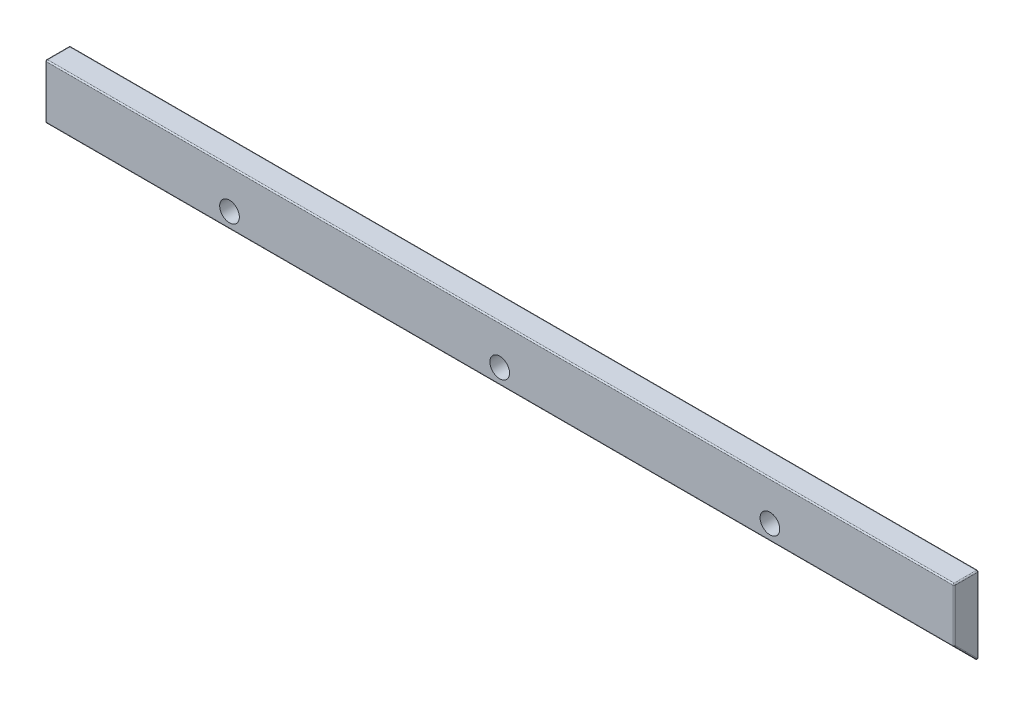
ISO-10303-21;
HEADER;
FILE_DESCRIPTION(('STEP AP214'),'2;1');
FILE_NAME('part.step','',(''),(''),'','','');
FILE_SCHEMA(('AUTOMOTIVE_DESIGN { 1 0 10303 214 1 1 1 1 }'));
ENDSEC;
DATA;
#1=APPLICATION_CONTEXT('core data for automotive mechanical design processes');
#2=APPLICATION_PROTOCOL_DEFINITION('international standard','automotive_design',2000,#1);
#3=PRODUCT_CONTEXT('',#1,'mechanical');
#4=PRODUCT('Part','Part','',(#3));
#5=PRODUCT_RELATED_PRODUCT_CATEGORY('part','',(#4));
#6=PRODUCT_DEFINITION_FORMATION('','',#4);
#7=PRODUCT_DEFINITION_CONTEXT('part definition',#1,'design');
#8=PRODUCT_DEFINITION('design','',#6,#7);
#9=PRODUCT_DEFINITION_SHAPE('','',#8);
#10=(LENGTH_UNIT() NAMED_UNIT(*) SI_UNIT(.MILLI.,.METRE.));
#11=(NAMED_UNIT(*) PLANE_ANGLE_UNIT() SI_UNIT($,.RADIAN.));
#12=(NAMED_UNIT(*) SI_UNIT($,.STERADIAN.) SOLID_ANGLE_UNIT());
#13=UNCERTAINTY_MEASURE_WITH_UNIT(LENGTH_MEASURE(1.E-05),#10,'distance_accuracy_value','');
#14=(GEOMETRIC_REPRESENTATION_CONTEXT(3) GLOBAL_UNCERTAINTY_ASSIGNED_CONTEXT((#13)) GLOBAL_UNIT_ASSIGNED_CONTEXT((#10,
#11,#12)) REPRESENTATION_CONTEXT('',''));
#15=CARTESIAN_POINT('',(0.,0.,0.));
#16=DIRECTION('',(0.,0.,1.));
#17=DIRECTION('',(1.,0.,0.));
#18=AXIS2_PLACEMENT_3D('',#15,#16,#17);
#19=CARTESIAN_POINT('',(43.7052218456962,-1.20000000000006,2.));
#20=DIRECTION('',(0.,0.,-1.));
#21=DIRECTION('',(-1.,0.,0.));
#22=AXIS2_PLACEMENT_3D('',#19,#20,#21);
#23=PLANE('',#22);
#24=CARTESIAN_POINT('',(22.,0.,2.));
#25=DIRECTION('',(0.,0.,1.));
#26=DIRECTION('',(1.,0.,0.));
#27=AXIS2_PLACEMENT_3D('',#24,#25,#26);
#28=CIRCLE('',#27,0.799999999999988);
#29=CARTESIAN_POINT('',(22.8,0.,2.));
#30=VERTEX_POINT('',#29);
#31=EDGE_CURVE('E592',#30,#30,#28,.T.);
#32=ORIENTED_EDGE('',*,*,#31,.F.);
#33=EDGE_LOOP('',(#32));
#34=FACE_BOUND('',#33,.T.);
#35=CARTESIAN_POINT('',(0.,0.,2.));
#36=DIRECTION('',(0.,0.,1.));
#37=DIRECTION('',(1.,0.,0.));
#38=AXIS2_PLACEMENT_3D('',#35,#36,#37);
#39=CIRCLE('',#38,0.799999999999988);
#40=CARTESIAN_POINT('',(0.799999999999988,0.,2.));
#41=VERTEX_POINT('',#40);
#42=EDGE_CURVE('E584',#41,#41,#39,.T.);
#43=ORIENTED_EDGE('',*,*,#42,.F.);
#44=EDGE_LOOP('',(#43));
#45=FACE_BOUND('',#44,.T.);
#46=DIRECTION('',(-1.,0.,0.));
#47=VECTOR('',#46,1.);
#48=CARTESIAN_POINT('',(43.7052218456962,-1.15857864376275,2.));
#49=LINE('',#48,#47);
#50=CARTESIAN_POINT('',(-36.9,-1.15857864376275,2.));
#51=VERTEX_POINT('',#50);
#52=CARTESIAN_POINT('',(36.9,-1.15857864376275,2.));
#53=VERTEX_POINT('',#52);
#54=EDGE_CURVE('E173',#51,#53,#49,.F.);
#55=ORIENTED_EDGE('',*,*,#54,.T.);
#56=DIRECTION('',(0.,-1.,0.));
#57=VECTOR('',#56,1.);
#58=CARTESIAN_POINT('',(36.9,3.20000000000006,2.));
#59=LINE('',#58,#57);
#60=CARTESIAN_POINT('',(36.9,3.10000000000006,2.));
#61=VERTEX_POINT('',#60);
#62=EDGE_CURVE('E178',#53,#61,#59,.F.);
#63=ORIENTED_EDGE('',*,*,#62,.T.);
#64=DIRECTION('',(-1.,0.,0.));
#65=VECTOR('',#64,1.);
#66=CARTESIAN_POINT('',(43.7052218456962,3.10000000000006,2.));
#67=LINE('',#66,#65);
#68=CARTESIAN_POINT('',(-36.9,3.10000000000006,2.));
#69=VERTEX_POINT('',#68);
#70=EDGE_CURVE('E175',#61,#69,#67,.T.);
#71=ORIENTED_EDGE('',*,*,#70,.T.);
#72=DIRECTION('',(0.,-1.,0.));
#73=VECTOR('',#72,1.);
#74=CARTESIAN_POINT('',(-36.9,-1.20000000000006,2.));
#75=LINE('',#74,#73);
#76=EDGE_CURVE('E171',#69,#51,#75,.T.);
#77=ORIENTED_EDGE('',*,*,#76,.T.);
#78=EDGE_LOOP('',(#55,#63,#71,#77));
#79=FACE_BOUND('',#78,.T.);
#80=CARTESIAN_POINT('',(-22.,0.,2.));
#81=DIRECTION('',(0.,0.,1.));
#82=DIRECTION('',(1.,0.,0.));
#83=AXIS2_PLACEMENT_3D('',#80,#81,#82);
#84=CIRCLE('',#83,0.799999999999988);
#85=CARTESIAN_POINT('',(-21.2,0.,2.));
#86=VERTEX_POINT('',#85);
#87=EDGE_CURVE('E577',#86,#86,#84,.T.);
#88=ORIENTED_EDGE('',*,*,#87,.F.);
#89=EDGE_LOOP('',(#88));
#90=FACE_BOUND('',#89,.T.);
#91=ADVANCED_FACE('F35',(#34,#45,#79,#90),#23,.F.);
#92=CARTESIAN_POINT('',(43.7052218456962,-3.20000000000006,0.));
#93=DIRECTION('',(0.,0.,1.));
#94=DIRECTION('',(1.,0.,0.));
#95=AXIS2_PLACEMENT_3D('',#92,#93,#94);
#96=PLANE('',#95);
#97=CARTESIAN_POINT('',(22.,0.,0.));
#98=DIRECTION('',(0.,0.,1.));
#99=DIRECTION('',(1.,0.,0.));
#100=AXIS2_PLACEMENT_3D('',#97,#98,#99);
#101=CIRCLE('',#100,0.799999999999988);
#102=CARTESIAN_POINT('',(22.8,0.,0.));
#103=VERTEX_POINT('',#102);
#104=EDGE_CURVE('E589',#103,#103,#101,.T.);
#105=ORIENTED_EDGE('',*,*,#104,.T.);
#106=EDGE_LOOP('',(#105));
#107=FACE_BOUND('',#106,.T.);
#108=CARTESIAN_POINT('',(0.,0.,0.));
#109=DIRECTION('',(0.,0.,1.));
#110=DIRECTION('',(1.,0.,0.));
#111=AXIS2_PLACEMENT_3D('',#108,#109,#110);
#112=CIRCLE('',#111,0.799999999999989);
#113=CARTESIAN_POINT('',(0.799999999999989,0.,0.));
#114=VERTEX_POINT('',#113);
#115=EDGE_CURVE('E579',#114,#114,#112,.T.);
#116=ORIENTED_EDGE('',*,*,#115,.T.);
#117=EDGE_LOOP('',(#116));
#118=FACE_BOUND('',#117,.T.);
#119=CARTESIAN_POINT('',(-22.,0.,0.));
#120=DIRECTION('',(0.,0.,1.));
#121=DIRECTION('',(1.,0.,0.));
#122=AXIS2_PLACEMENT_3D('',#119,#120,#121);
#123=CIRCLE('',#122,0.799999999999988);
#124=CARTESIAN_POINT('',(-21.2,0.,0.));
#125=VERTEX_POINT('',#124);
#126=EDGE_CURVE('E134',#125,#125,#123,.T.);
#127=ORIENTED_EDGE('',*,*,#126,.T.);
#128=EDGE_LOOP('',(#127));
#129=FACE_BOUND('',#128,.T.);
#130=DIRECTION('',(-1.,0.,0.));
#131=VECTOR('',#130,1.);
#132=CARTESIAN_POINT('',(43.7052218456962,3.10000000000006,0.));
#133=LINE('',#132,#131);
#134=CARTESIAN_POINT('',(-36.9,3.10000000000006,0.));
#135=VERTEX_POINT('',#134);
#136=CARTESIAN_POINT('',(36.9,3.10000000000006,0.));
#137=VERTEX_POINT('',#136);
#138=EDGE_CURVE('E131',#135,#137,#133,.F.);
#139=ORIENTED_EDGE('',*,*,#138,.T.);
#140=DIRECTION('',(0.,1.,0.));
#141=VECTOR('',#140,1.);
#142=CARTESIAN_POINT('',(36.9,-3.20000000000006,0.));
#143=LINE('',#142,#141);
#144=CARTESIAN_POINT('',(36.9,-2.95857864376275,0.));
#145=VERTEX_POINT('',#144);
#146=EDGE_CURVE('E169',#137,#145,#143,.F.);
#147=ORIENTED_EDGE('',*,*,#146,.T.);
#148=DIRECTION('',(-1.,0.,0.));
#149=VECTOR('',#148,1.);
#150=CARTESIAN_POINT('',(43.7052218456962,-2.95857864376275,0.));
#151=LINE('',#150,#149);
#152=CARTESIAN_POINT('',(-36.9,-2.95857864376275,0.));
#153=VERTEX_POINT('',#152);
#154=EDGE_CURVE('E166',#145,#153,#151,.T.);
#155=ORIENTED_EDGE('',*,*,#154,.T.);
#156=DIRECTION('',(0.,1.,0.));
#157=VECTOR('',#156,1.);
#158=CARTESIAN_POINT('',(-36.9,3.20000000000006,0.));
#159=LINE('',#158,#157);
#160=EDGE_CURVE('E161',#153,#135,#159,.T.);
#161=ORIENTED_EDGE('',*,*,#160,.T.);
#162=EDGE_LOOP('',(#139,#147,#155,#161));
#163=FACE_BOUND('',#162,.T.);
#164=ADVANCED_FACE('F295',(#107,#118,#129,#163),#96,.F.);
#165=CARTESIAN_POINT('',(43.7052218456962,3.20000000000006,2.));
#166=DIRECTION('',(0.,-1.,0.));
#167=DIRECTION('',(0.,0.,-1.));
#168=AXIS2_PLACEMENT_3D('',#165,#166,#167);
#169=PLANE('',#168);
#170=DIRECTION('',(-1.,0.,0.));
#171=VECTOR('',#170,1.);
#172=CARTESIAN_POINT('',(43.7052218456962,3.20000000000006,1.9));
#173=LINE('',#172,#171);
#174=CARTESIAN_POINT('',(-36.9,3.20000000000006,1.9));
#175=VERTEX_POINT('',#174);
#176=CARTESIAN_POINT('',(36.9,3.20000000000006,1.9));
#177=VERTEX_POINT('',#176);
#178=EDGE_CURVE('E154',#175,#177,#173,.F.);
#179=ORIENTED_EDGE('',*,*,#178,.T.);
#180=DIRECTION('',(0.,0.,1.));
#181=VECTOR('',#180,1.);
#182=CARTESIAN_POINT('',(36.9,3.20000000000006,0.));
#183=LINE('',#182,#181);
#184=CARTESIAN_POINT('',(36.9,3.20000000000006,0.1));
#185=VERTEX_POINT('',#184);
#186=EDGE_CURVE('E158',#177,#185,#183,.F.);
#187=ORIENTED_EDGE('',*,*,#186,.T.);
#188=DIRECTION('',(-1.,0.,0.));
#189=VECTOR('',#188,1.);
#190=CARTESIAN_POINT('',(43.7052218456962,3.20000000000006,0.1));
#191=LINE('',#190,#189);
#192=CARTESIAN_POINT('',(-36.9,3.20000000000006,0.1));
#193=VERTEX_POINT('',#192);
#194=EDGE_CURVE('E129',#185,#193,#191,.T.);
#195=ORIENTED_EDGE('',*,*,#194,.T.);
#196=DIRECTION('',(0.,0.,1.));
#197=VECTOR('',#196,1.);
#198=CARTESIAN_POINT('',(-36.9,3.20000000000006,2.));
#199=LINE('',#198,#197);
#200=EDGE_CURVE('E148',#193,#175,#199,.T.);
#201=ORIENTED_EDGE('',*,*,#200,.T.);
#202=EDGE_LOOP('',(#179,#187,#195,#201));
#203=FACE_BOUND('',#202,.T.);
#204=ADVANCED_FACE('F156',(#203),#169,.F.);
#205=CARTESIAN_POINT('',(43.7052218456962,-3.20000000000006,0.));
#206=DIRECTION('',(0.,0.707106781186548,-0.707106781186547));
#207=DIRECTION('',(0.,0.707106781186547,0.707106781186548));
#208=AXIS2_PLACEMENT_3D('',#205,#206,#207);
#209=PLANE('',#208);
#210=DIRECTION('',(-1.,0.,0.));
#211=VECTOR('',#210,1.);
#212=CARTESIAN_POINT('',(43.7052218456962,-3.0292893218814,0.170710678118655));
#213=LINE('',#212,#211);
#214=CARTESIAN_POINT('',(-36.9,-3.0292893218814,0.170710678118655));
#215=VERTEX_POINT('',#214);
#216=CARTESIAN_POINT('',(36.9,-3.0292893218814,0.170710678118655));
#217=VERTEX_POINT('',#216);
#218=EDGE_CURVE('E184',#215,#217,#213,.F.);
#219=ORIENTED_EDGE('',*,*,#218,.T.);
#220=DIRECTION('',(0.,-0.707106781186547,-0.707106781186548));
#221=VECTOR('',#220,1.);
#222=CARTESIAN_POINT('',(36.9,-1.20000000000007,1.99999999999999));
#223=LINE('',#222,#221);
#224=CARTESIAN_POINT('',(36.9,-1.2292893218814,1.97071067811865));
#225=VERTEX_POINT('',#224);
#226=EDGE_CURVE('E187',#217,#225,#223,.F.);
#227=ORIENTED_EDGE('',*,*,#226,.T.);
#228=DIRECTION('',(-1.,0.,0.));
#229=VECTOR('',#228,1.);
#230=CARTESIAN_POINT('',(43.7052218456962,-1.2292893218814,1.97071067811865));
#231=LINE('',#230,#229);
#232=CARTESIAN_POINT('',(-36.9,-1.2292893218814,1.97071067811865));
#233=VERTEX_POINT('',#232);
#234=EDGE_CURVE('E182',#225,#233,#231,.T.);
#235=ORIENTED_EDGE('',*,*,#234,.T.);
#236=DIRECTION('',(0.,-0.707106781186547,-0.707106781186548));
#237=VECTOR('',#236,1.);
#238=CARTESIAN_POINT('',(-36.9,-3.20000000000006,0.));
#239=LINE('',#238,#237);
#240=EDGE_CURVE('E180',#233,#215,#239,.T.);
#241=ORIENTED_EDGE('',*,*,#240,.T.);
#242=EDGE_LOOP('',(#219,#227,#235,#241));
#243=FACE_BOUND('',#242,.T.);
#244=ADVANCED_FACE('F308',(#243),#209,.F.);
#245=CARTESIAN_POINT('',(37.,-80.8,224.488099265355));
#246=DIRECTION('',(1.,0.,0.));
#247=DIRECTION('',(0.,-1.,0.));
#248=AXIS2_PLACEMENT_3D('',#245,#246,#247);
#249=PLANE('',#248);
#250=DIRECTION('',(0.,0.,1.));
#251=VECTOR('',#250,1.);
#252=CARTESIAN_POINT('',(37.,3.10000000000005,2.));
#253=LINE('',#252,#251);
#254=CARTESIAN_POINT('',(37.,3.10000000000005,0.099999999999989));
#255=VERTEX_POINT('',#254);
#256=CARTESIAN_POINT('',(37.,3.10000000000005,1.90000000000001));
#257=VERTEX_POINT('',#256);
#258=EDGE_CURVE('E193',#255,#257,#253,.T.);
#259=ORIENTED_EDGE('',*,*,#258,.T.);
#260=DIRECTION('',(0.,-1.,0.));
#261=VECTOR('',#260,1.);
#262=CARTESIAN_POINT('',(37.,-1.20000000000006,1.90000000000001));
#263=LINE('',#262,#261);
#264=CARTESIAN_POINT('',(37.,-1.1585786437627,1.90000000000001));
#265=VERTEX_POINT('',#264);
#266=EDGE_CURVE('E195',#257,#265,#263,.T.);
#267=ORIENTED_EDGE('',*,*,#266,.T.);
#268=DIRECTION('',(0.,-0.707106781186547,-0.707106781186548));
#269=VECTOR('',#268,1.);
#270=CARTESIAN_POINT('',(37.,-3.1292893218814,-0.0707106781186878));
#271=LINE('',#270,#269);
#272=CARTESIAN_POINT('',(37.,-2.95857864376273,0.099999999999989));
#273=VERTEX_POINT('',#272);
#274=EDGE_CURVE('E189',#265,#273,#271,.T.);
#275=ORIENTED_EDGE('',*,*,#274,.T.);
#276=DIRECTION('',(0.,1.,0.));
#277=VECTOR('',#276,1.);
#278=CARTESIAN_POINT('',(37.,3.20000000000006,0.099999999999989));
#279=LINE('',#278,#277);
#280=EDGE_CURVE('E191',#273,#255,#279,.T.);
#281=ORIENTED_EDGE('',*,*,#280,.T.);
#282=EDGE_LOOP('',(#259,#267,#275,#281));
#283=FACE_BOUND('',#282,.T.);
#284=ADVANCED_FACE('F273',(#283),#249,.T.);
#285=CARTESIAN_POINT('',(-37.,-80.8,224.488099265355));
#286=DIRECTION('',(-1.,0.,0.));
#287=DIRECTION('',(0.,1.,0.));
#288=AXIS2_PLACEMENT_3D('',#285,#286,#287);
#289=PLANE('',#288);
#290=DIRECTION('',(0.,-1.,0.));
#291=VECTOR('',#290,1.);
#292=CARTESIAN_POINT('',(-37.,3.20000000000006,1.9));
#293=LINE('',#292,#291);
#294=CARTESIAN_POINT('',(-37.,-1.15857864376275,1.9));
#295=VERTEX_POINT('',#294);
#296=CARTESIAN_POINT('',(-37.,3.10000000000006,1.9));
#297=VERTEX_POINT('',#296);
#298=EDGE_CURVE('E44',#295,#297,#293,.F.);
#299=ORIENTED_EDGE('',*,*,#298,.T.);
#300=DIRECTION('',(0.,0.,1.));
#301=VECTOR('',#300,1.);
#302=CARTESIAN_POINT('',(-37.,3.10000000000006,0.));
#303=LINE('',#302,#301);
#304=CARTESIAN_POINT('',(-37.,3.10000000000006,0.1));
#305=VERTEX_POINT('',#304);
#306=EDGE_CURVE('E11',#297,#305,#303,.F.);
#307=ORIENTED_EDGE('',*,*,#306,.T.);
#308=DIRECTION('',(0.,1.,0.));
#309=VECTOR('',#308,1.);
#310=CARTESIAN_POINT('',(-37.,-3.20000000000006,0.1));
#311=LINE('',#310,#309);
#312=CARTESIAN_POINT('',(-37.,-2.95857864376275,0.1));
#313=VERTEX_POINT('',#312);
#314=EDGE_CURVE('E198',#305,#313,#311,.F.);
#315=ORIENTED_EDGE('',*,*,#314,.T.);
#316=DIRECTION('',(0.,-0.707106781186547,-0.707106781186548));
#317=VECTOR('',#316,1.);
#318=CARTESIAN_POINT('',(-37.,-1.1292893218814,1.92928932188135));
#319=LINE('',#318,#317);
#320=EDGE_CURVE('E55',#313,#295,#319,.F.);
#321=ORIENTED_EDGE('',*,*,#320,.T.);
#322=EDGE_LOOP('',(#299,#307,#315,#321));
#323=FACE_BOUND('',#322,.T.);
#324=ADVANCED_FACE('F301',(#323),#289,.T.);
#325=CARTESIAN_POINT('',(43.7052218456962,-1.15857864376275,1.9));
#326=DIRECTION('',(-1.,0.,0.));
#327=DIRECTION('',(0.,0.,1.));
#328=AXIS2_PLACEMENT_3D('',#325,#326,#327);
#329=CYLINDRICAL_SURFACE('',#328,0.1);
#330=CARTESIAN_POINT('',(36.9,-1.15857864376275,1.9));
#331=DIRECTION('',(1.,0.,0.));
#332=DIRECTION('',(0.,1.,0.));
#333=AXIS2_PLACEMENT_3D('',#330,#331,#332);
#334=CIRCLE('',#333,0.1);
#335=EDGE_CURVE('E39',#53,#225,#334,.T.);
#336=ORIENTED_EDGE('',*,*,#335,.F.);
#337=ORIENTED_EDGE('',*,*,#54,.F.);
#338=CARTESIAN_POINT('',(-36.9,-1.15857864376275,1.9));
#339=DIRECTION('',(-1.,0.,0.));
#340=DIRECTION('',(0.,0.,1.));
#341=AXIS2_PLACEMENT_3D('',#338,#339,#340);
#342=CIRCLE('',#341,0.1);
#343=EDGE_CURVE('E251',#233,#51,#342,.T.);
#344=ORIENTED_EDGE('',*,*,#343,.F.);
#345=ORIENTED_EDGE('',*,*,#234,.F.);
#346=EDGE_LOOP('',(#336,#337,#344,#345));
#347=FACE_BOUND('',#346,.T.);
#348=ADVANCED_FACE('F37',(#347),#329,.T.);
#349=CARTESIAN_POINT('',(36.9,-1.15857864376275,1.9));
#350=DIRECTION('',(0.,0.,1.));
#351=DIRECTION('',(1.,0.,0.));
#352=AXIS2_PLACEMENT_3D('',#349,#350,#351);
#353=SPHERICAL_SURFACE('',#352,0.1);
#354=CARTESIAN_POINT('',(36.9,-1.1585786437627,1.90000000000001));
#355=DIRECTION('',(0.,-1.,-4.40186082029171E-13));
#356=DIRECTION('',(0.,4.40186082029171E-13,-1.));
#357=AXIS2_PLACEMENT_3D('',#354,#355,#356);
#358=CIRCLE('',#357,0.1);
#359=EDGE_CURVE('E246',#53,#265,#358,.F.);
#360=ORIENTED_EDGE('',*,*,#359,.F.);
#361=ORIENTED_EDGE('',*,*,#335,.T.);
#362=CARTESIAN_POINT('',(36.9,-1.15857864376275,1.9));
#363=DIRECTION('',(-4.03256168587688E-13,0.707106781186548,0.707106781186548));
#364=DIRECTION('',(0.,-0.707106781186548,0.707106781186548));
#365=AXIS2_PLACEMENT_3D('',#362,#363,#364);
#366=CIRCLE('',#365,0.1);
#367=EDGE_CURVE('E249',#265,#225,#366,.F.);
#368=ORIENTED_EDGE('',*,*,#367,.F.);
#369=EDGE_LOOP('',(#360,#361,#368));
#370=FACE_BOUND('',#369,.T.);
#371=ADVANCED_FACE('F262',(#370),#353,.T.);
#372=CARTESIAN_POINT('',(-36.9,-1.15857864376275,1.9));
#373=DIRECTION('',(0.,0.,1.));
#374=DIRECTION('',(1.,0.,0.));
#375=AXIS2_PLACEMENT_3D('',#372,#373,#374);
#376=SPHERICAL_SURFACE('',#375,0.1);
#377=CARTESIAN_POINT('',(-36.9,-1.15857864376275,1.9));
#378=DIRECTION('',(0.,0.707106781186549,0.707106781186546));
#379=DIRECTION('',(0.,-0.707106781186546,0.707106781186549));
#380=AXIS2_PLACEMENT_3D('',#377,#378,#379);
#381=CIRCLE('',#380,0.1);
#382=EDGE_CURVE('E241',#233,#295,#381,.F.);
#383=ORIENTED_EDGE('',*,*,#382,.F.);
#384=ORIENTED_EDGE('',*,*,#343,.T.);
#385=CARTESIAN_POINT('',(-36.9,-1.15857864376275,1.9));
#386=DIRECTION('',(0.,-1.,0.));
#387=DIRECTION('',(1.,0.,0.));
#388=AXIS2_PLACEMENT_3D('',#385,#386,#387);
#389=CIRCLE('',#388,0.1);
#390=EDGE_CURVE('E243',#295,#51,#389,.F.);
#391=ORIENTED_EDGE('',*,*,#390,.F.);
#392=EDGE_LOOP('',(#383,#384,#391));
#393=FACE_BOUND('',#392,.T.);
#394=ADVANCED_FACE('F374',(#393),#376,.T.);
#395=CARTESIAN_POINT('',(36.9,70.3147603107963,73.3733389545591));
#396=DIRECTION('',(0.,0.707106781186547,0.707106781186548));
#397=DIRECTION('',(0.,-0.707106781186548,0.707106781186547));
#398=AXIS2_PLACEMENT_3D('',#395,#396,#397);
#399=CYLINDRICAL_SURFACE('',#398,0.1);
#400=ORIENTED_EDGE('',*,*,#367,.T.);
#401=ORIENTED_EDGE('',*,*,#226,.F.);
#402=CARTESIAN_POINT('',(36.9,-2.95857864376273,0.099999999999989));
#403=DIRECTION('',(0.,-0.707106781186498,-0.707106781186597));
#404=DIRECTION('',(0.,0.707106781186597,-0.707106781186498));
#405=AXIS2_PLACEMENT_3D('',#402,#403,#404);
#406=CIRCLE('',#405,0.1);
#407=EDGE_CURVE('E236',#273,#217,#406,.T.);
#408=ORIENTED_EDGE('',*,*,#407,.F.);
#409=ORIENTED_EDGE('',*,*,#274,.F.);
#410=EDGE_LOOP('',(#400,#401,#408,#409));
#411=FACE_BOUND('',#410,.T.);
#412=ADVANCED_FACE('F269',(#411),#399,.T.);
#413=CARTESIAN_POINT('',(36.9,-80.8,1.90000000000001));
#414=DIRECTION('',(0.,1.,0.));
#415=DIRECTION('',(-1.,0.,0.));
#416=AXIS2_PLACEMENT_3D('',#413,#414,#415);
#417=CYLINDRICAL_SURFACE('',#416,0.1);
#418=ORIENTED_EDGE('',*,*,#359,.T.);
#419=ORIENTED_EDGE('',*,*,#266,.F.);
#420=CARTESIAN_POINT('',(36.9,3.10000000000006,1.9));
#421=DIRECTION('',(0.,1.,0.));
#422=DIRECTION('',(-1.,0.,0.));
#423=AXIS2_PLACEMENT_3D('',#420,#421,#422);
#424=CIRCLE('',#423,0.1);
#425=EDGE_CURVE('E233',#61,#257,#424,.T.);
#426=ORIENTED_EDGE('',*,*,#425,.F.);
#427=ORIENTED_EDGE('',*,*,#62,.F.);
#428=EDGE_LOOP('',(#418,#419,#426,#427));
#429=FACE_BOUND('',#428,.T.);
#430=ADVANCED_FACE('F279',(#429),#417,.T.);
#431=CARTESIAN_POINT('',(43.7052218456962,3.10000000000006,1.9));
#432=DIRECTION('',(-1.,0.,0.));
#433=DIRECTION('',(0.,0.,1.));
#434=AXIS2_PLACEMENT_3D('',#431,#432,#433);
#435=CYLINDRICAL_SURFACE('',#434,0.1);
#436=CARTESIAN_POINT('',(-36.9,3.10000000000006,1.9));
#437=DIRECTION('',(-1.,0.,0.));
#438=DIRECTION('',(0.,0.,1.));
#439=AXIS2_PLACEMENT_3D('',#436,#437,#438);
#440=CIRCLE('',#439,0.1);
#441=EDGE_CURVE('E227',#69,#175,#440,.T.);
#442=ORIENTED_EDGE('',*,*,#441,.F.);
#443=ORIENTED_EDGE('',*,*,#70,.F.);
#444=CARTESIAN_POINT('',(36.9,3.10000000000006,1.9));
#445=DIRECTION('',(1.,0.,0.));
#446=DIRECTION('',(0.,0.,-1.));
#447=AXIS2_PLACEMENT_3D('',#444,#445,#446);
#448=CIRCLE('',#447,0.1);
#449=EDGE_CURVE('E230',#177,#61,#448,.T.);
#450=ORIENTED_EDGE('',*,*,#449,.F.);
#451=ORIENTED_EDGE('',*,*,#178,.F.);
#452=EDGE_LOOP('',(#442,#443,#450,#451));
#453=FACE_BOUND('',#452,.T.);
#454=ADVANCED_FACE('F365',(#453),#435,.T.);
#455=CARTESIAN_POINT('',(-36.9,-1.20000000000005,1.9));
#456=DIRECTION('',(0.,1.,0.));
#457=DIRECTION('',(-1.,0.,0.));
#458=AXIS2_PLACEMENT_3D('',#455,#456,#457);
#459=CYLINDRICAL_SURFACE('',#458,0.1);
#460=ORIENTED_EDGE('',*,*,#390,.T.);
#461=ORIENTED_EDGE('',*,*,#76,.F.);
#462=CARTESIAN_POINT('',(-36.9,3.10000000000006,1.9));
#463=DIRECTION('',(0.,1.,0.));
#464=DIRECTION('',(0.,0.,1.));
#465=AXIS2_PLACEMENT_3D('',#462,#463,#464);
#466=CIRCLE('',#465,0.1);
#467=EDGE_CURVE('E225',#297,#69,#466,.T.);
#468=ORIENTED_EDGE('',*,*,#467,.F.);
#469=ORIENTED_EDGE('',*,*,#298,.F.);
#470=EDGE_LOOP('',(#460,#461,#468,#469));
#471=FACE_BOUND('',#470,.T.);
#472=ADVANCED_FACE('F361',(#471),#459,.T.);
#473=CARTESIAN_POINT('',(-36.9,-3.1292893218814,-0.0707106781186507));
#474=DIRECTION('',(0.,0.707106781186547,0.707106781186548));
#475=DIRECTION('',(0.,-0.707106781186548,0.707106781186547));
#476=AXIS2_PLACEMENT_3D('',#473,#474,#475);
#477=CYLINDRICAL_SURFACE('',#476,0.1);
#478=ORIENTED_EDGE('',*,*,#382,.T.);
#479=ORIENTED_EDGE('',*,*,#320,.F.);
#480=CARTESIAN_POINT('',(-36.9,-2.95857864376275,0.1));
#481=DIRECTION('',(0.,-0.707106781186547,-0.707106781186548));
#482=DIRECTION('',(0.,0.707106781186548,-0.707106781186547));
#483=AXIS2_PLACEMENT_3D('',#480,#481,#482);
#484=CIRCLE('',#483,0.1);
#485=EDGE_CURVE('E222',#215,#313,#484,.T.);
#486=ORIENTED_EDGE('',*,*,#485,.F.);
#487=ORIENTED_EDGE('',*,*,#240,.F.);
#488=EDGE_LOOP('',(#478,#479,#486,#487));
#489=FACE_BOUND('',#488,.T.);
#490=ADVANCED_FACE('F357',(#489),#477,.T.);
#491=CARTESIAN_POINT('',(43.7052218456962,-2.95857864376275,0.1));
#492=DIRECTION('',(-1.,0.,0.));
#493=DIRECTION('',(0.,0.,1.));
#494=AXIS2_PLACEMENT_3D('',#491,#492,#493);
#495=CYLINDRICAL_SURFACE('',#494,0.1);
#496=CARTESIAN_POINT('',(36.9,-2.95857864376275,0.1));
#497=DIRECTION('',(1.,0.,0.));
#498=DIRECTION('',(0.,0.,-1.));
#499=AXIS2_PLACEMENT_3D('',#496,#497,#498);
#500=CIRCLE('',#499,0.1);
#501=EDGE_CURVE('E238',#217,#145,#500,.T.);
#502=ORIENTED_EDGE('',*,*,#501,.F.);
#503=ORIENTED_EDGE('',*,*,#218,.F.);
#504=CARTESIAN_POINT('',(-36.9,-2.95857864376275,0.1));
#505=DIRECTION('',(-1.,0.,0.));
#506=DIRECTION('',(0.,0.,1.));
#507=AXIS2_PLACEMENT_3D('',#504,#505,#506);
#508=CIRCLE('',#507,0.1);
#509=EDGE_CURVE('E219',#153,#215,#508,.T.);
#510=ORIENTED_EDGE('',*,*,#509,.F.);
#511=ORIENTED_EDGE('',*,*,#154,.F.);
#512=EDGE_LOOP('',(#502,#503,#510,#511));
#513=FACE_BOUND('',#512,.T.);
#514=ADVANCED_FACE('F353',(#513),#495,.T.);
#515=CARTESIAN_POINT('',(36.9,-2.95857864376275,0.1));
#516=DIRECTION('',(0.,0.,1.));
#517=DIRECTION('',(1.,0.,0.));
#518=AXIS2_PLACEMENT_3D('',#515,#516,#517);
#519=SPHERICAL_SURFACE('',#518,0.1);
#520=ORIENTED_EDGE('',*,*,#407,.T.);
#521=ORIENTED_EDGE('',*,*,#501,.T.);
#522=CARTESIAN_POINT('',(36.9,-2.95857864376275,0.1));
#523=DIRECTION('',(2.08166817117211E-13,-1.,0.));
#524=DIRECTION('',(1.,2.08166817117211E-13,0.));
#525=AXIS2_PLACEMENT_3D('',#522,#523,#524);
#526=CIRCLE('',#525,0.1);
#527=EDGE_CURVE('E216',#273,#145,#526,.F.);
#528=ORIENTED_EDGE('',*,*,#527,.F.);
#529=EDGE_LOOP('',(#520,#521,#528));
#530=FACE_BOUND('',#529,.T.);
#531=ADVANCED_FACE('F350',(#530),#519,.T.);
#532=CARTESIAN_POINT('',(36.9,3.10000000000006,1.9));
#533=DIRECTION('',(0.,0.,1.));
#534=DIRECTION('',(1.,0.,0.));
#535=AXIS2_PLACEMENT_3D('',#532,#533,#534);
#536=SPHERICAL_SURFACE('',#535,0.1);
#537=ORIENTED_EDGE('',*,*,#449,.T.);
#538=ORIENTED_EDGE('',*,*,#425,.T.);
#539=CARTESIAN_POINT('',(36.9,3.10000000000005,1.90000000000001));
#540=DIRECTION('',(0.,1.27935856353285E-13,1.));
#541=DIRECTION('',(0.,-1.,1.27935856353285E-13));
#542=AXIS2_PLACEMENT_3D('',#539,#540,#541);
#543=CIRCLE('',#542,0.1);
#544=EDGE_CURVE('E213',#177,#257,#543,.F.);
#545=ORIENTED_EDGE('',*,*,#544,.F.);
#546=EDGE_LOOP('',(#537,#538,#545));
#547=FACE_BOUND('',#546,.T.);
#548=ADVANCED_FACE('F282',(#547),#536,.T.);
#549=CARTESIAN_POINT('',(-36.9,3.10000000000006,1.9));
#550=DIRECTION('',(0.,0.,1.));
#551=DIRECTION('',(1.,0.,0.));
#552=AXIS2_PLACEMENT_3D('',#549,#550,#551);
#553=SPHERICAL_SURFACE('',#552,0.1);
#554=ORIENTED_EDGE('',*,*,#467,.T.);
#555=ORIENTED_EDGE('',*,*,#441,.T.);
#556=CARTESIAN_POINT('',(-36.9,3.10000000000006,1.9));
#557=DIRECTION('',(0.,0.,1.));
#558=DIRECTION('',(1.,0.,0.));
#559=AXIS2_PLACEMENT_3D('',#556,#557,#558);
#560=CIRCLE('',#559,0.1);
#561=EDGE_CURVE('E151',#297,#175,#560,.F.);
#562=ORIENTED_EDGE('',*,*,#561,.F.);
#563=EDGE_LOOP('',(#554,#555,#562));
#564=FACE_BOUND('',#563,.T.);
#565=ADVANCED_FACE('F343',(#564),#553,.T.);
#566=CARTESIAN_POINT('',(-36.9,-2.95857864376275,0.1));
#567=DIRECTION('',(0.,0.,1.));
#568=DIRECTION('',(1.,0.,0.));
#569=AXIS2_PLACEMENT_3D('',#566,#567,#568);
#570=SPHERICAL_SURFACE('',#569,0.1);
#571=ORIENTED_EDGE('',*,*,#509,.T.);
#572=ORIENTED_EDGE('',*,*,#485,.T.);
#573=CARTESIAN_POINT('',(-36.9,-2.95857864376275,0.1));
#574=DIRECTION('',(0.,-1.,0.));
#575=DIRECTION('',(0.,0.,-1.));
#576=AXIS2_PLACEMENT_3D('',#573,#574,#575);
#577=CIRCLE('',#576,0.1);
#578=EDGE_CURVE('E209',#153,#313,#577,.F.);
#579=ORIENTED_EDGE('',*,*,#578,.F.);
#580=EDGE_LOOP('',(#571,#572,#579));
#581=FACE_BOUND('',#580,.T.);
#582=ADVANCED_FACE('F340',(#581),#570,.T.);
#583=CARTESIAN_POINT('',(36.9,-80.8,0.099999999999989));
#584=DIRECTION('',(0.,-1.,0.));
#585=DIRECTION('',(1.,0.,0.));
#586=AXIS2_PLACEMENT_3D('',#583,#584,#585);
#587=CYLINDRICAL_SURFACE('',#586,0.1);
#588=ORIENTED_EDGE('',*,*,#527,.T.);
#589=ORIENTED_EDGE('',*,*,#146,.F.);
#590=CARTESIAN_POINT('',(36.9,3.10000000000005,0.099999999999989));
#591=DIRECTION('',(0.,1.,0.));
#592=DIRECTION('',(0.,0.,1.));
#593=AXIS2_PLACEMENT_3D('',#590,#591,#592);
#594=CIRCLE('',#593,0.1);
#595=EDGE_CURVE('E206',#255,#137,#594,.T.);
#596=ORIENTED_EDGE('',*,*,#595,.F.);
#597=ORIENTED_EDGE('',*,*,#280,.F.);
#598=EDGE_LOOP('',(#588,#589,#596,#597));
#599=FACE_BOUND('',#598,.T.);
#600=ADVANCED_FACE('F292',(#599),#587,.T.);
#601=CARTESIAN_POINT('',(36.9,3.1000000000001,224.488099265355));
#602=DIRECTION('',(0.,0.,-1.));
#603=DIRECTION('',(0.,1.,0.));
#604=AXIS2_PLACEMENT_3D('',#601,#602,#603);
#605=CYLINDRICAL_SURFACE('',#604,0.1);
#606=ORIENTED_EDGE('',*,*,#544,.T.);
#607=ORIENTED_EDGE('',*,*,#258,.F.);
#608=CARTESIAN_POINT('',(36.9,3.10000000000006,0.1));
#609=DIRECTION('',(-1.10588621593518E-13,0.,-1.));
#610=DIRECTION('',(-1.,0.,1.10588621593518E-13));
#611=AXIS2_PLACEMENT_3D('',#608,#609,#610);
#612=CIRCLE('',#611,0.1);
#613=EDGE_CURVE('E145',#185,#255,#612,.T.);
#614=ORIENTED_EDGE('',*,*,#613,.F.);
#615=ORIENTED_EDGE('',*,*,#186,.F.);
#616=EDGE_LOOP('',(#606,#607,#614,#615));
#617=FACE_BOUND('',#616,.T.);
#618=ADVANCED_FACE('F285',(#617),#605,.T.);
#619=CARTESIAN_POINT('',(-36.9,3.10000000000006,2.));
#620=DIRECTION('',(0.,0.,-1.));
#621=DIRECTION('',(0.,1.,0.));
#622=AXIS2_PLACEMENT_3D('',#619,#620,#621);
#623=CYLINDRICAL_SURFACE('',#622,0.1);
#624=ORIENTED_EDGE('',*,*,#561,.T.);
#625=ORIENTED_EDGE('',*,*,#200,.F.);
#626=CARTESIAN_POINT('',(-36.9,3.10000000000006,0.1));
#627=DIRECTION('',(0.,0.,-1.));
#628=DIRECTION('',(0.,1.,0.));
#629=AXIS2_PLACEMENT_3D('',#626,#627,#628);
#630=CIRCLE('',#629,0.1);
#631=EDGE_CURVE('E137',#305,#193,#630,.T.);
#632=ORIENTED_EDGE('',*,*,#631,.F.);
#633=ORIENTED_EDGE('',*,*,#306,.F.);
#634=EDGE_LOOP('',(#624,#625,#632,#633));
#635=FACE_BOUND('',#634,.T.);
#636=ADVANCED_FACE('F149',(#635),#623,.T.);
#637=CARTESIAN_POINT('',(-36.9,-3.20000000000005,0.1));
#638=DIRECTION('',(0.,-1.,0.));
#639=DIRECTION('',(1.,0.,0.));
#640=AXIS2_PLACEMENT_3D('',#637,#638,#639);
#641=CYLINDRICAL_SURFACE('',#640,0.1);
#642=ORIENTED_EDGE('',*,*,#578,.T.);
#643=ORIENTED_EDGE('',*,*,#314,.F.);
#644=CARTESIAN_POINT('',(-36.9,3.10000000000006,0.1));
#645=DIRECTION('',(0.,1.,0.));
#646=DIRECTION('',(0.,0.,1.));
#647=AXIS2_PLACEMENT_3D('',#644,#645,#646);
#648=CIRCLE('',#647,0.1);
#649=EDGE_CURVE('E141',#135,#305,#648,.T.);
#650=ORIENTED_EDGE('',*,*,#649,.F.);
#651=ORIENTED_EDGE('',*,*,#160,.F.);
#652=EDGE_LOOP('',(#642,#643,#650,#651));
#653=FACE_BOUND('',#652,.T.);
#654=ADVANCED_FACE('F299',(#653),#641,.T.);
#655=CARTESIAN_POINT('',(36.9,3.10000000000006,0.1));
#656=DIRECTION('',(0.,0.,1.));
#657=DIRECTION('',(1.,0.,0.));
#658=AXIS2_PLACEMENT_3D('',#655,#656,#657);
#659=SPHERICAL_SURFACE('',#658,0.1);
#660=ORIENTED_EDGE('',*,*,#613,.T.);
#661=ORIENTED_EDGE('',*,*,#595,.T.);
#662=CARTESIAN_POINT('',(36.9,3.10000000000006,0.1));
#663=DIRECTION('',(1.,0.,0.));
#664=DIRECTION('',(0.,0.,-1.));
#665=AXIS2_PLACEMENT_3D('',#662,#663,#664);
#666=CIRCLE('',#665,0.1);
#667=EDGE_CURVE('E133',#185,#137,#666,.F.);
#668=ORIENTED_EDGE('',*,*,#667,.F.);
#669=EDGE_LOOP('',(#660,#661,#668));
#670=FACE_BOUND('',#669,.T.);
#671=ADVANCED_FACE('F289',(#670),#659,.T.);
#672=CARTESIAN_POINT('',(-36.9,3.10000000000006,0.1));
#673=DIRECTION('',(0.,0.,1.));
#674=DIRECTION('',(1.,0.,0.));
#675=AXIS2_PLACEMENT_3D('',#672,#673,#674);
#676=SPHERICAL_SURFACE('',#675,0.1);
#677=ORIENTED_EDGE('',*,*,#649,.T.);
#678=ORIENTED_EDGE('',*,*,#631,.T.);
#679=CARTESIAN_POINT('',(-36.9,3.10000000000006,0.1));
#680=DIRECTION('',(-1.,0.,0.));
#681=DIRECTION('',(0.,0.,1.));
#682=AXIS2_PLACEMENT_3D('',#679,#680,#681);
#683=CIRCLE('',#682,0.1);
#684=EDGE_CURVE('E125',#135,#193,#683,.F.);
#685=ORIENTED_EDGE('',*,*,#684,.F.);
#686=EDGE_LOOP('',(#677,#678,#685));
#687=FACE_BOUND('',#686,.T.);
#688=ADVANCED_FACE('F139',(#687),#676,.T.);
#689=CARTESIAN_POINT('',(43.7052218456962,3.10000000000006,0.1));
#690=DIRECTION('',(-1.,0.,0.));
#691=DIRECTION('',(0.,0.,1.));
#692=AXIS2_PLACEMENT_3D('',#689,#690,#691);
#693=CYLINDRICAL_SURFACE('',#692,0.1);
#694=ORIENTED_EDGE('',*,*,#667,.T.);
#695=ORIENTED_EDGE('',*,*,#138,.F.);
#696=ORIENTED_EDGE('',*,*,#684,.T.);
#697=ORIENTED_EDGE('',*,*,#194,.F.);
#698=EDGE_LOOP('',(#694,#695,#696,#697));
#699=FACE_BOUND('',#698,.T.);
#700=ADVANCED_FACE('F127',(#699),#693,.T.);
#701=CARTESIAN_POINT('',(-22.,0.,2.));
#702=DIRECTION('',(0.,0.,1.));
#703=DIRECTION('',(1.,0.,0.));
#704=AXIS2_PLACEMENT_3D('',#701,#702,#703);
#705=CYLINDRICAL_SURFACE('',#704,0.799999999999988);
#706=ORIENTED_EDGE('',*,*,#126,.F.);
#707=EDGE_LOOP('',(#706));
#708=FACE_BOUND('',#707,.T.);
#709=ORIENTED_EDGE('',*,*,#87,.T.);
#710=EDGE_LOOP('',(#709));
#711=FACE_BOUND('',#710,.T.);
#712=ADVANCED_FACE('F327',(#708,#711),#705,.F.);
#713=CARTESIAN_POINT('',(0.,0.,2.));
#714=DIRECTION('',(0.,0.,1.));
#715=DIRECTION('',(1.,0.,0.));
#716=AXIS2_PLACEMENT_3D('',#713,#714,#715);
#717=CYLINDRICAL_SURFACE('',#716,0.799999999999989);
#718=ORIENTED_EDGE('',*,*,#115,.F.);
#719=EDGE_LOOP('',(#718));
#720=FACE_BOUND('',#719,.T.);
#721=ORIENTED_EDGE('',*,*,#42,.T.);
#722=EDGE_LOOP('',(#721));
#723=FACE_BOUND('',#722,.T.);
#724=ADVANCED_FACE('F459',(#720,#723),#717,.F.);
#725=CARTESIAN_POINT('',(22.,0.,2.));
#726=DIRECTION('',(0.,0.,1.));
#727=DIRECTION('',(1.,0.,0.));
#728=AXIS2_PLACEMENT_3D('',#725,#726,#727);
#729=CYLINDRICAL_SURFACE('',#728,0.799999999999988);
#730=ORIENTED_EDGE('',*,*,#104,.F.);
#731=EDGE_LOOP('',(#730));
#732=FACE_BOUND('',#731,.T.);
#733=ORIENTED_EDGE('',*,*,#31,.T.);
#734=EDGE_LOOP('',(#733));
#735=FACE_BOUND('',#734,.T.);
#736=ADVANCED_FACE('F467',(#732,#735),#729,.F.);
#737=CLOSED_SHELL('',(#91,#164,#204,#244,#284,#324,#348,#371,#394,#412,#430,#454,#472,#490,#514,
#531,#548,#565,#582,#600,#618,#636,#654,#671,#688,#700,#712,#724,#736));
#738=MANIFOLD_SOLID_BREP('B2',#737);
#739=ADVANCED_BREP_SHAPE_REPRESENTATION('',(#18,#738),#14);
#740=SHAPE_DEFINITION_REPRESENTATION(#9,#739);
ENDSEC;
END-ISO-10303-21;
